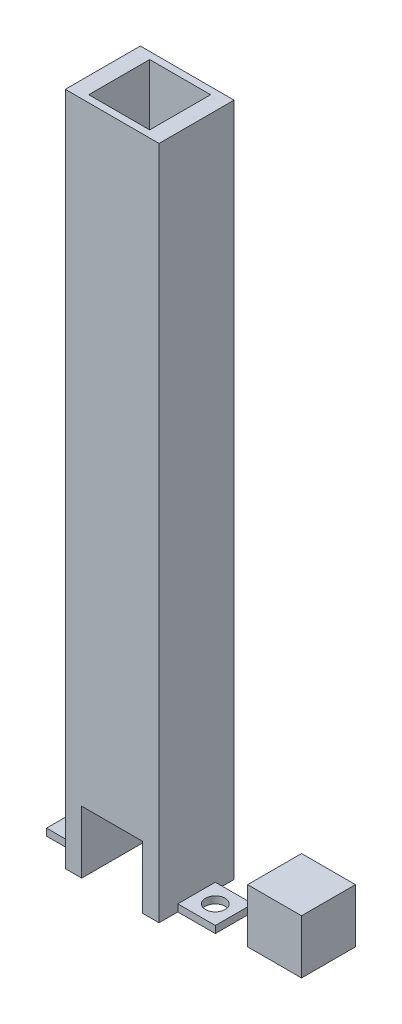
ISO-10303-21;
HEADER;
FILE_DESCRIPTION(('STEP AP214'),'2;1');
FILE_NAME('part.step','',(''),(''),'','','');
FILE_SCHEMA(('AUTOMOTIVE_DESIGN { 1 0 10303 214 1 1 1 1 }'));
ENDSEC;
DATA;
#1=APPLICATION_CONTEXT('core data for automotive mechanical design processes');
#2=APPLICATION_PROTOCOL_DEFINITION('international standard','automotive_design',2000,#1);
#3=PRODUCT_CONTEXT('',#1,'mechanical');
#4=PRODUCT('Part','Part','',(#3));
#5=PRODUCT_RELATED_PRODUCT_CATEGORY('part','',(#4));
#6=PRODUCT_DEFINITION_FORMATION('','',#4);
#7=PRODUCT_DEFINITION_CONTEXT('part definition',#1,'design');
#8=PRODUCT_DEFINITION('design','',#6,#7);
#9=PRODUCT_DEFINITION_SHAPE('','',#8);
#10=(LENGTH_UNIT() NAMED_UNIT(*) SI_UNIT(.MILLI.,.METRE.));
#11=(NAMED_UNIT(*) PLANE_ANGLE_UNIT() SI_UNIT($,.RADIAN.));
#12=(NAMED_UNIT(*) SI_UNIT($,.STERADIAN.) SOLID_ANGLE_UNIT());
#13=UNCERTAINTY_MEASURE_WITH_UNIT(LENGTH_MEASURE(1.E-05),#10,'distance_accuracy_value','');
#14=(GEOMETRIC_REPRESENTATION_CONTEXT(3) GLOBAL_UNCERTAINTY_ASSIGNED_CONTEXT((#13)) GLOBAL_UNIT_ASSIGNED_CONTEXT((#10,
#11,#12)) REPRESENTATION_CONTEXT('',''));
#15=CARTESIAN_POINT('',(0.,0.,0.));
#16=DIRECTION('',(0.,0.,1.));
#17=DIRECTION('',(1.,0.,0.));
#18=AXIS2_PLACEMENT_3D('',#15,#16,#17);
#19=CARTESIAN_POINT('',(-45.8981588772787,-12.,16.));
#20=DIRECTION('',(1.,0.,0.));
#21=DIRECTION('',(0.,0.,-1.));
#22=AXIS2_PLACEMENT_3D('',#19,#20,#21);
#23=PLANE('',#22);
#24=DIRECTION('',(0.,-1.,0.));
#25=VECTOR('',#24,1.);
#26=CARTESIAN_POINT('',(-45.8981588772787,-12.,4.));
#27=LINE('',#26,#25);
#28=CARTESIAN_POINT('',(-45.8981588772787,-10.5,4.));
#29=VERTEX_POINT('',#28);
#30=CARTESIAN_POINT('',(-45.8981588772787,-12.,4.));
#31=VERTEX_POINT('',#30);
#32=EDGE_CURVE('E66',#29,#31,#27,.T.);
#33=ORIENTED_EDGE('',*,*,#32,.F.);
#34=DIRECTION('',(0.,0.,-1.));
#35=VECTOR('',#34,1.);
#36=CARTESIAN_POINT('',(-45.8981588772787,-10.5,4.));
#37=LINE('',#36,#35);
#38=CARTESIAN_POINT('',(-45.8981588772787,-10.5,12.));
#39=VERTEX_POINT('',#38);
#40=EDGE_CURVE('E227',#39,#29,#37,.T.);
#41=ORIENTED_EDGE('',*,*,#40,.F.);
#42=DIRECTION('',(0.,1.,0.));
#43=VECTOR('',#42,1.);
#44=CARTESIAN_POINT('',(-45.8981588772787,-12.,12.));
#45=LINE('',#44,#43);
#46=CARTESIAN_POINT('',(-45.8981588772787,-12.,12.));
#47=VERTEX_POINT('',#46);
#48=EDGE_CURVE('E235',#47,#39,#45,.T.);
#49=ORIENTED_EDGE('',*,*,#48,.F.);
#50=DIRECTION('',(0.,0.,-1.));
#51=VECTOR('',#50,1.);
#52=CARTESIAN_POINT('',(-45.8981588772787,-12.,16.));
#53=LINE('',#52,#51);
#54=CARTESIAN_POINT('',(-45.8981588772787,-12.,16.));
#55=VERTEX_POINT('',#54);
#56=EDGE_CURVE('E12',#55,#47,#53,.T.);
#57=ORIENTED_EDGE('',*,*,#56,.F.);
#58=DIRECTION('',(0.,-1.,0.));
#59=VECTOR('',#58,1.);
#60=CARTESIAN_POINT('',(-45.8981588772787,-12.,16.));
#61=LINE('',#60,#59);
#62=CARTESIAN_POINT('',(-45.8981588772787,132.,16.));
#63=VERTEX_POINT('',#62);
#64=EDGE_CURVE('E307',#63,#55,#61,.T.);
#65=ORIENTED_EDGE('',*,*,#64,.F.);
#66=DIRECTION('',(0.,0.,-1.));
#67=VECTOR('',#66,1.);
#68=CARTESIAN_POINT('',(-45.8981588772787,132.,16.));
#69=LINE('',#68,#67);
#70=CARTESIAN_POINT('',(-45.8981588772787,132.,0.));
#71=VERTEX_POINT('',#70);
#72=EDGE_CURVE('E319',#63,#71,#69,.T.);
#73=ORIENTED_EDGE('',*,*,#72,.T.);
#74=DIRECTION('',(0.,-1.,0.));
#75=VECTOR('',#74,1.);
#76=CARTESIAN_POINT('',(-45.8981588772787,-12.,0.));
#77=LINE('',#76,#75);
#78=CARTESIAN_POINT('',(-45.8981588772787,-12.,0.));
#79=VERTEX_POINT('',#78);
#80=EDGE_CURVE('E301',#71,#79,#77,.T.);
#81=ORIENTED_EDGE('',*,*,#80,.T.);
#82=EDGE_CURVE('E51',#31,#79,#53,.T.);
#83=ORIENTED_EDGE('',*,*,#82,.F.);
#84=EDGE_LOOP('',(#33,#41,#49,#57,#65,#73,#81,#83));
#85=FACE_BOUND('',#84,.T.);
#86=ADVANCED_FACE('F44',(#85),#23,.F.);
#87=CARTESIAN_POINT('',(-45.8981588772787,-12.,16.));
#88=DIRECTION('',(0.,1.,0.));
#89=DIRECTION('',(0.,0.,1.));
#90=AXIS2_PLACEMENT_3D('',#87,#88,#89);
#91=PLANE('',#90);
#92=CARTESIAN_POINT('',(-49.8981588772787,-12.,8.));
#93=DIRECTION('',(0.,1.,0.));
#94=DIRECTION('',(0.,0.,1.));
#95=AXIS2_PLACEMENT_3D('',#92,#93,#94);
#96=CIRCLE('',#95,2.1);
#97=CARTESIAN_POINT('',(-49.8981588772787,-12.,10.1));
#98=VERTEX_POINT('',#97);
#99=EDGE_CURVE('E220',#98,#98,#96,.T.);
#100=ORIENTED_EDGE('',*,*,#99,.T.);
#101=EDGE_LOOP('',(#100));
#102=FACE_BOUND('',#101,.T.);
#103=DIRECTION('',(1.,0.,0.));
#104=VECTOR('',#103,1.);
#105=CARTESIAN_POINT('',(-45.8981588772787,-12.,0.));
#106=LINE('',#105,#104);
#107=CARTESIAN_POINT('',(-42.3981588772787,-12.,0.));
#108=VERTEX_POINT('',#107);
#109=EDGE_CURVE('E323',#79,#108,#106,.T.);
#110=ORIENTED_EDGE('',*,*,#109,.T.);
#111=DIRECTION('',(0.,0.,1.));
#112=VECTOR('',#111,1.);
#113=CARTESIAN_POINT('',(-42.3981588772787,-12.,1.5));
#114=LINE('',#113,#112);
#115=CARTESIAN_POINT('',(-42.3981588772787,-12.,16.));
#116=VERTEX_POINT('',#115);
#117=EDGE_CURVE('E285',#108,#116,#114,.T.);
#118=ORIENTED_EDGE('',*,*,#117,.T.);
#119=DIRECTION('',(1.,0.,0.));
#120=VECTOR('',#119,1.);
#121=CARTESIAN_POINT('',(-45.8981588772787,-12.,16.));
#122=LINE('',#121,#120);
#123=EDGE_CURVE('E312',#55,#116,#122,.T.);
#124=ORIENTED_EDGE('',*,*,#123,.F.);
#125=ORIENTED_EDGE('',*,*,#56,.T.);
#126=DIRECTION('',(1.,0.,0.));
#127=VECTOR('',#126,1.);
#128=CARTESIAN_POINT('',(-53.8981588772787,-12.,12.));
#129=LINE('',#128,#127);
#130=CARTESIAN_POINT('',(-53.8981588772787,-12.,12.));
#131=VERTEX_POINT('',#130);
#132=EDGE_CURVE('E244',#131,#47,#129,.T.);
#133=ORIENTED_EDGE('',*,*,#132,.F.);
#134=DIRECTION('',(0.,0.,1.));
#135=VECTOR('',#134,1.);
#136=CARTESIAN_POINT('',(-53.8981588772787,-12.,4.));
#137=LINE('',#136,#135);
#138=CARTESIAN_POINT('',(-53.8981588772787,-12.,4.));
#139=VERTEX_POINT('',#138);
#140=EDGE_CURVE('E226',#139,#131,#137,.T.);
#141=ORIENTED_EDGE('',*,*,#140,.F.);
#142=DIRECTION('',(1.,0.,0.));
#143=VECTOR('',#142,1.);
#144=CARTESIAN_POINT('',(-53.8981588772787,-12.,4.));
#145=LINE('',#144,#143);
#146=EDGE_CURVE('E247',#139,#31,#145,.T.);
#147=ORIENTED_EDGE('',*,*,#146,.T.);
#148=ORIENTED_EDGE('',*,*,#82,.T.);
#149=EDGE_LOOP('',(#110,#118,#124,#125,#133,#141,#147,#148));
#150=FACE_BOUND('',#149,.T.);
#151=ADVANCED_FACE('F379',(#102,#150),#91,.F.);
#152=CARTESIAN_POINT('',(-21.8981588772787,-12.,8.));
#153=DIRECTION('',(0.,1.,0.));
#154=DIRECTION('',(0.,0.,1.));
#155=AXIS2_PLACEMENT_3D('',#152,#153,#154);
#156=CIRCLE('',#155,2.1);
#157=CARTESIAN_POINT('',(-21.8981588772787,-12.,10.1));
#158=VERTEX_POINT('',#157);
#159=EDGE_CURVE('E210',#158,#158,#156,.F.);
#160=ORIENTED_EDGE('',*,*,#159,.F.);
#161=EDGE_LOOP('',(#160));
#162=FACE_BOUND('',#161,.T.);
#163=DIRECTION('',(0.,0.,1.));
#164=VECTOR('',#163,1.);
#165=CARTESIAN_POINT('',(-29.3981588772787,-12.,1.5));
#166=LINE('',#165,#164);
#167=CARTESIAN_POINT('',(-29.3981588772787,-12.,0.));
#168=VERTEX_POINT('',#167);
#169=CARTESIAN_POINT('',(-29.3981588772787,-12.,16.));
#170=VERTEX_POINT('',#169);
#171=EDGE_CURVE('E283',#168,#170,#166,.T.);
#172=ORIENTED_EDGE('',*,*,#171,.F.);
#173=CARTESIAN_POINT('',(-25.8981588772787,-12.,0.));
#174=VERTEX_POINT('',#173);
#175=EDGE_CURVE('E322',#168,#174,#106,.T.);
#176=ORIENTED_EDGE('',*,*,#175,.T.);
#177=DIRECTION('',(0.,0.,-1.));
#178=VECTOR('',#177,1.);
#179=CARTESIAN_POINT('',(-25.8981588772787,-12.,16.));
#180=LINE('',#179,#178);
#181=CARTESIAN_POINT('',(-25.8981588772787,-12.,4.));
#182=VERTEX_POINT('',#181);
#183=EDGE_CURVE('E333',#182,#174,#180,.T.);
#184=ORIENTED_EDGE('',*,*,#183,.F.);
#185=DIRECTION('',(-1.,0.,0.));
#186=VECTOR('',#185,1.);
#187=CARTESIAN_POINT('',(-17.8981588772787,-12.,4.));
#188=LINE('',#187,#186);
#189=CARTESIAN_POINT('',(-17.8981588772787,-12.,4.));
#190=VERTEX_POINT('',#189);
#191=EDGE_CURVE('E207',#190,#182,#188,.T.);
#192=ORIENTED_EDGE('',*,*,#191,.F.);
#193=DIRECTION('',(0.,0.,1.));
#194=VECTOR('',#193,1.);
#195=CARTESIAN_POINT('',(-17.8981588772787,-12.,4.));
#196=LINE('',#195,#194);
#197=CARTESIAN_POINT('',(-17.8981588772787,-12.,12.));
#198=VERTEX_POINT('',#197);
#199=EDGE_CURVE('E197',#190,#198,#196,.T.);
#200=ORIENTED_EDGE('',*,*,#199,.T.);
#201=DIRECTION('',(-1.,0.,0.));
#202=VECTOR('',#201,1.);
#203=CARTESIAN_POINT('',(-17.8981588772787,-12.,12.));
#204=LINE('',#203,#202);
#205=CARTESIAN_POINT('',(-25.8981588772787,-12.,12.));
#206=VERTEX_POINT('',#205);
#207=EDGE_CURVE('E215',#198,#206,#204,.T.);
#208=ORIENTED_EDGE('',*,*,#207,.T.);
#209=CARTESIAN_POINT('',(-25.8981588772787,-12.,16.));
#210=VERTEX_POINT('',#209);
#211=EDGE_CURVE('E334',#210,#206,#180,.T.);
#212=ORIENTED_EDGE('',*,*,#211,.F.);
#213=EDGE_CURVE('E310',#170,#210,#122,.T.);
#214=ORIENTED_EDGE('',*,*,#213,.F.);
#215=EDGE_LOOP('',(#172,#176,#184,#192,#200,#208,#212,#214));
#216=FACE_BOUND('',#215,.T.);
#217=ADVANCED_FACE('F346',(#162,#216),#91,.F.);
#218=CARTESIAN_POINT('',(-25.8981588772787,-12.,16.));
#219=DIRECTION('',(-1.,0.,0.));
#220=DIRECTION('',(0.,0.,1.));
#221=AXIS2_PLACEMENT_3D('',#218,#219,#220);
#222=PLANE('',#221);
#223=DIRECTION('',(0.,0.,-1.));
#224=VECTOR('',#223,1.);
#225=CARTESIAN_POINT('',(-25.8981588772787,-10.5,4.));
#226=LINE('',#225,#224);
#227=CARTESIAN_POINT('',(-25.8981588772787,-10.5,12.));
#228=VERTEX_POINT('',#227);
#229=CARTESIAN_POINT('',(-25.8981588772787,-10.5,4.));
#230=VERTEX_POINT('',#229);
#231=EDGE_CURVE('E209',#228,#230,#226,.T.);
#232=ORIENTED_EDGE('',*,*,#231,.T.);
#233=DIRECTION('',(0.,-1.,0.));
#234=VECTOR('',#233,1.);
#235=CARTESIAN_POINT('',(-25.8981588772787,-12.,4.));
#236=LINE('',#235,#234);
#237=EDGE_CURVE('E58',#230,#182,#236,.T.);
#238=ORIENTED_EDGE('',*,*,#237,.T.);
#239=ORIENTED_EDGE('',*,*,#183,.T.);
#240=DIRECTION('',(0.,1.,0.));
#241=VECTOR('',#240,1.);
#242=CARTESIAN_POINT('',(-25.8981588772787,-12.,0.));
#243=LINE('',#242,#241);
#244=CARTESIAN_POINT('',(-25.8981588772787,132.,0.));
#245=VERTEX_POINT('',#244);
#246=EDGE_CURVE('E326',#174,#245,#243,.T.);
#247=ORIENTED_EDGE('',*,*,#246,.T.);
#248=DIRECTION('',(0.,0.,-1.));
#249=VECTOR('',#248,1.);
#250=CARTESIAN_POINT('',(-25.8981588772787,132.,16.));
#251=LINE('',#250,#249);
#252=CARTESIAN_POINT('',(-25.8981588772787,132.,16.));
#253=VERTEX_POINT('',#252);
#254=EDGE_CURVE('E331',#253,#245,#251,.T.);
#255=ORIENTED_EDGE('',*,*,#254,.F.);
#256=DIRECTION('',(0.,1.,0.));
#257=VECTOR('',#256,1.);
#258=CARTESIAN_POINT('',(-25.8981588772787,-12.,16.));
#259=LINE('',#258,#257);
#260=EDGE_CURVE('E315',#210,#253,#259,.T.);
#261=ORIENTED_EDGE('',*,*,#260,.F.);
#262=ORIENTED_EDGE('',*,*,#211,.T.);
#263=DIRECTION('',(0.,1.,0.));
#264=VECTOR('',#263,1.);
#265=CARTESIAN_POINT('',(-25.8981588772787,-12.,12.));
#266=LINE('',#265,#264);
#267=EDGE_CURVE('E198',#206,#228,#266,.T.);
#268=ORIENTED_EDGE('',*,*,#267,.T.);
#269=EDGE_LOOP('',(#232,#238,#239,#247,#255,#261,#262,#268));
#270=FACE_BOUND('',#269,.T.);
#271=ADVANCED_FACE('F341',(#270),#222,.F.);
#272=CARTESIAN_POINT('',(-45.8981588772787,132.,16.));
#273=DIRECTION('',(0.,-1.,0.));
#274=DIRECTION('',(0.,0.,-1.));
#275=AXIS2_PLACEMENT_3D('',#272,#273,#274);
#276=PLANE('',#275);
#277=DIRECTION('',(0.,0.,1.));
#278=VECTOR('',#277,1.);
#279=CARTESIAN_POINT('',(-29.3981588772787,132.,1.5));
#280=LINE('',#279,#278);
#281=CARTESIAN_POINT('',(-29.3981588772787,132.,1.5));
#282=VERTEX_POINT('',#281);
#283=CARTESIAN_POINT('',(-29.3981588772787,132.,14.5));
#284=VERTEX_POINT('',#283);
#285=EDGE_CURVE('E291',#282,#284,#280,.T.);
#286=ORIENTED_EDGE('',*,*,#285,.T.);
#287=DIRECTION('',(1.,0.,0.));
#288=VECTOR('',#287,1.);
#289=CARTESIAN_POINT('',(-42.3981588772787,132.,14.5));
#290=LINE('',#289,#288);
#291=CARTESIAN_POINT('',(-42.3981588772787,132.,14.5));
#292=VERTEX_POINT('',#291);
#293=EDGE_CURVE('E282',#292,#284,#290,.T.);
#294=ORIENTED_EDGE('',*,*,#293,.F.);
#295=DIRECTION('',(0.,0.,1.));
#296=VECTOR('',#295,1.);
#297=CARTESIAN_POINT('',(-42.3981588772787,132.,1.5));
#298=LINE('',#297,#296);
#299=CARTESIAN_POINT('',(-42.3981588772787,132.,1.5));
#300=VERTEX_POINT('',#299);
#301=EDGE_CURVE('E286',#300,#292,#298,.T.);
#302=ORIENTED_EDGE('',*,*,#301,.F.);
#303=DIRECTION('',(1.,0.,0.));
#304=VECTOR('',#303,1.);
#305=CARTESIAN_POINT('',(-42.3981588772787,132.,1.5));
#306=LINE('',#305,#304);
#307=EDGE_CURVE('E294',#300,#282,#306,.T.);
#308=ORIENTED_EDGE('',*,*,#307,.T.);
#309=EDGE_LOOP('',(#286,#294,#302,#308));
#310=FACE_BOUND('',#309,.T.);
#311=DIRECTION('',(-1.,0.,0.));
#312=VECTOR('',#311,1.);
#313=CARTESIAN_POINT('',(-45.8981588772787,132.,0.));
#314=LINE('',#313,#312);
#315=EDGE_CURVE('E311',#245,#71,#314,.T.);
#316=ORIENTED_EDGE('',*,*,#315,.T.);
#317=ORIENTED_EDGE('',*,*,#72,.F.);
#318=DIRECTION('',(-1.,0.,0.));
#319=VECTOR('',#318,1.);
#320=CARTESIAN_POINT('',(-45.8981588772787,132.,16.));
#321=LINE('',#320,#319);
#322=EDGE_CURVE('E317',#253,#63,#321,.T.);
#323=ORIENTED_EDGE('',*,*,#322,.F.);
#324=ORIENTED_EDGE('',*,*,#254,.T.);
#325=EDGE_LOOP('',(#316,#317,#323,#324));
#326=FACE_BOUND('',#325,.T.);
#327=ADVANCED_FACE('F356',(#310,#326),#276,.F.);
#328=CARTESIAN_POINT('',(0.,0.,16.));
#329=DIRECTION('',(0.,0.,-1.));
#330=DIRECTION('',(-1.,0.,0.));
#331=AXIS2_PLACEMENT_3D('',#328,#329,#330);
#332=PLANE('',#331);
#333=ORIENTED_EDGE('',*,*,#123,.T.);
#334=DIRECTION('',(0.,-1.,0.));
#335=VECTOR('',#334,1.);
#336=CARTESIAN_POINT('',(-42.3981588772787,1.3,16.));
#337=LINE('',#336,#335);
#338=CARTESIAN_POINT('',(-42.3981588772787,1.3,16.));
#339=VERTEX_POINT('',#338);
#340=EDGE_CURVE('E266',#339,#116,#337,.T.);
#341=ORIENTED_EDGE('',*,*,#340,.F.);
#342=DIRECTION('',(-1.,0.,0.));
#343=VECTOR('',#342,1.);
#344=CARTESIAN_POINT('',(-29.3981588772787,1.3,16.));
#345=LINE('',#344,#343);
#346=CARTESIAN_POINT('',(-29.3981588772787,1.3,16.));
#347=VERTEX_POINT('',#346);
#348=EDGE_CURVE('E274',#347,#339,#345,.T.);
#349=ORIENTED_EDGE('',*,*,#348,.F.);
#350=DIRECTION('',(0.,-1.,0.));
#351=VECTOR('',#350,1.);
#352=CARTESIAN_POINT('',(-29.3981588772787,1.3,16.));
#353=LINE('',#352,#351);
#354=EDGE_CURVE('E271',#347,#170,#353,.T.);
#355=ORIENTED_EDGE('',*,*,#354,.T.);
#356=ORIENTED_EDGE('',*,*,#213,.T.);
#357=ORIENTED_EDGE('',*,*,#260,.T.);
#358=ORIENTED_EDGE('',*,*,#322,.T.);
#359=ORIENTED_EDGE('',*,*,#64,.T.);
#360=EDGE_LOOP('',(#333,#341,#349,#355,#356,#357,#358,#359));
#361=FACE_BOUND('',#360,.T.);
#362=ADVANCED_FACE('F361',(#361),#332,.F.);
#363=CARTESIAN_POINT('',(0.,0.,0.));
#364=DIRECTION('',(0.,0.,-1.));
#365=DIRECTION('',(-1.,0.,0.));
#366=AXIS2_PLACEMENT_3D('',#363,#364,#365);
#367=PLANE('',#366);
#368=DIRECTION('',(0.,-1.,0.));
#369=VECTOR('',#368,1.);
#370=CARTESIAN_POINT('',(-29.3981588772787,-4.,0.));
#371=LINE('',#370,#369);
#372=CARTESIAN_POINT('',(-29.3981588772787,-4.,0.));
#373=VERTEX_POINT('',#372);
#374=EDGE_CURVE('E250',#373,#168,#371,.T.);
#375=ORIENTED_EDGE('',*,*,#374,.F.);
#376=DIRECTION('',(1.,0.,0.));
#377=VECTOR('',#376,1.);
#378=CARTESIAN_POINT('',(-42.3981588772787,-4.,0.));
#379=LINE('',#378,#377);
#380=CARTESIAN_POINT('',(-42.3981588772787,-4.,0.));
#381=VERTEX_POINT('',#380);
#382=EDGE_CURVE('E258',#381,#373,#379,.T.);
#383=ORIENTED_EDGE('',*,*,#382,.F.);
#384=DIRECTION('',(0.,-1.,0.));
#385=VECTOR('',#384,1.);
#386=CARTESIAN_POINT('',(-42.3981588772787,-4.,0.));
#387=LINE('',#386,#385);
#388=EDGE_CURVE('E255',#381,#108,#387,.T.);
#389=ORIENTED_EDGE('',*,*,#388,.T.);
#390=ORIENTED_EDGE('',*,*,#109,.F.);
#391=ORIENTED_EDGE('',*,*,#80,.F.);
#392=ORIENTED_EDGE('',*,*,#315,.F.);
#393=ORIENTED_EDGE('',*,*,#246,.F.);
#394=ORIENTED_EDGE('',*,*,#175,.F.);
#395=EDGE_LOOP('',(#375,#383,#389,#390,#391,#392,#393,#394));
#396=FACE_BOUND('',#395,.T.);
#397=ADVANCED_FACE('F351',(#396),#367,.T.);
#398=CARTESIAN_POINT('',(-42.3981588772787,-12.,14.5));
#399=DIRECTION('',(0.,0.,1.));
#400=DIRECTION('',(1.,0.,0.));
#401=AXIS2_PLACEMENT_3D('',#398,#399,#400);
#402=PLANE('',#401);
#403=DIRECTION('',(0.,1.,0.));
#404=VECTOR('',#403,1.);
#405=CARTESIAN_POINT('',(-29.3981588772787,-12.,14.5));
#406=LINE('',#405,#404);
#407=CARTESIAN_POINT('',(-29.3981588772787,1.3,14.5));
#408=VERTEX_POINT('',#407);
#409=EDGE_CURVE('E288',#408,#284,#406,.T.);
#410=ORIENTED_EDGE('',*,*,#409,.F.);
#411=DIRECTION('',(-1.,0.,0.));
#412=VECTOR('',#411,1.);
#413=CARTESIAN_POINT('',(-29.3981588772787,1.3,14.5));
#414=LINE('',#413,#412);
#415=CARTESIAN_POINT('',(-42.3981588772787,1.3,14.5));
#416=VERTEX_POINT('',#415);
#417=EDGE_CURVE('E267',#408,#416,#414,.T.);
#418=ORIENTED_EDGE('',*,*,#417,.T.);
#419=DIRECTION('',(0.,1.,0.));
#420=VECTOR('',#419,1.);
#421=CARTESIAN_POINT('',(-42.3981588772787,-12.,14.5));
#422=LINE('',#421,#420);
#423=EDGE_CURVE('E299',#416,#292,#422,.T.);
#424=ORIENTED_EDGE('',*,*,#423,.T.);
#425=ORIENTED_EDGE('',*,*,#293,.T.);
#426=EDGE_LOOP('',(#410,#418,#424,#425));
#427=FACE_BOUND('',#426,.T.);
#428=ADVANCED_FACE('F397',(#427),#402,.F.);
#429=CARTESIAN_POINT('',(-42.3981588772787,-12.,1.5));
#430=DIRECTION('',(-1.,0.,0.));
#431=DIRECTION('',(0.,0.,1.));
#432=AXIS2_PLACEMENT_3D('',#429,#430,#431);
#433=PLANE('',#432);
#434=ORIENTED_EDGE('',*,*,#301,.T.);
#435=ORIENTED_EDGE('',*,*,#423,.F.);
#436=DIRECTION('',(0.,0.,1.));
#437=VECTOR('',#436,1.);
#438=CARTESIAN_POINT('',(-42.3981588772787,1.3,14.5));
#439=LINE('',#438,#437);
#440=EDGE_CURVE('E280',#416,#339,#439,.T.);
#441=ORIENTED_EDGE('',*,*,#440,.T.);
#442=ORIENTED_EDGE('',*,*,#340,.T.);
#443=ORIENTED_EDGE('',*,*,#117,.F.);
#444=ORIENTED_EDGE('',*,*,#388,.F.);
#445=DIRECTION('',(0.,0.,-1.));
#446=VECTOR('',#445,1.);
#447=CARTESIAN_POINT('',(-42.3981588772787,-4.,1.5));
#448=LINE('',#447,#446);
#449=CARTESIAN_POINT('',(-42.3981588772787,-4.,1.5));
#450=VERTEX_POINT('',#449);
#451=EDGE_CURVE('E254',#450,#381,#448,.T.);
#452=ORIENTED_EDGE('',*,*,#451,.F.);
#453=DIRECTION('',(0.,1.,0.));
#454=VECTOR('',#453,1.);
#455=CARTESIAN_POINT('',(-42.3981588772787,-12.,1.5));
#456=LINE('',#455,#454);
#457=EDGE_CURVE('E302',#450,#300,#456,.T.);
#458=ORIENTED_EDGE('',*,*,#457,.T.);
#459=EDGE_LOOP('',(#434,#435,#441,#442,#443,#444,#452,#458));
#460=FACE_BOUND('',#459,.T.);
#461=ADVANCED_FACE('F402',(#460),#433,.F.);
#462=CARTESIAN_POINT('',(-42.3981588772787,-12.,1.5));
#463=DIRECTION('',(0.,0.,1.));
#464=DIRECTION('',(1.,0.,0.));
#465=AXIS2_PLACEMENT_3D('',#462,#463,#464);
#466=PLANE('',#465);
#467=DIRECTION('',(1.,0.,0.));
#468=VECTOR('',#467,1.);
#469=CARTESIAN_POINT('',(-42.3981588772787,-4.,1.5));
#470=LINE('',#469,#468);
#471=CARTESIAN_POINT('',(-29.3981588772787,-4.,1.5));
#472=VERTEX_POINT('',#471);
#473=EDGE_CURVE('E251',#450,#472,#470,.T.);
#474=ORIENTED_EDGE('',*,*,#473,.T.);
#475=DIRECTION('',(0.,1.,0.));
#476=VECTOR('',#475,1.);
#477=CARTESIAN_POINT('',(-29.3981588772787,-12.,1.5));
#478=LINE('',#477,#476);
#479=EDGE_CURVE('E304',#472,#282,#478,.T.);
#480=ORIENTED_EDGE('',*,*,#479,.T.);
#481=ORIENTED_EDGE('',*,*,#307,.F.);
#482=ORIENTED_EDGE('',*,*,#457,.F.);
#483=EDGE_LOOP('',(#474,#480,#481,#482));
#484=FACE_BOUND('',#483,.T.);
#485=ADVANCED_FACE('F408',(#484),#466,.T.);
#486=CARTESIAN_POINT('',(-29.3981588772787,-12.,1.5));
#487=DIRECTION('',(-1.,0.,0.));
#488=DIRECTION('',(0.,0.,1.));
#489=AXIS2_PLACEMENT_3D('',#486,#487,#488);
#490=PLANE('',#489);
#491=ORIENTED_EDGE('',*,*,#285,.F.);
#492=ORIENTED_EDGE('',*,*,#479,.F.);
#493=DIRECTION('',(0.,0.,-1.));
#494=VECTOR('',#493,1.);
#495=CARTESIAN_POINT('',(-29.3981588772787,-4.,1.5));
#496=LINE('',#495,#494);
#497=EDGE_CURVE('E264',#472,#373,#496,.T.);
#498=ORIENTED_EDGE('',*,*,#497,.T.);
#499=ORIENTED_EDGE('',*,*,#374,.T.);
#500=ORIENTED_EDGE('',*,*,#171,.T.);
#501=ORIENTED_EDGE('',*,*,#354,.F.);
#502=DIRECTION('',(0.,0.,1.));
#503=VECTOR('',#502,1.);
#504=CARTESIAN_POINT('',(-29.3981588772787,1.3,14.5));
#505=LINE('',#504,#503);
#506=EDGE_CURVE('E270',#408,#347,#505,.T.);
#507=ORIENTED_EDGE('',*,*,#506,.F.);
#508=ORIENTED_EDGE('',*,*,#409,.T.);
#509=EDGE_LOOP('',(#491,#492,#498,#499,#500,#501,#507,#508));
#510=FACE_BOUND('',#509,.T.);
#511=ADVANCED_FACE('F404',(#510),#490,.T.);
#512=CARTESIAN_POINT('',(-29.3981588772787,1.3,14.5));
#513=DIRECTION('',(0.,1.,0.));
#514=DIRECTION('',(-1.,0.,0.));
#515=AXIS2_PLACEMENT_3D('',#512,#513,#514);
#516=PLANE('',#515);
#517=ORIENTED_EDGE('',*,*,#348,.T.);
#518=ORIENTED_EDGE('',*,*,#440,.F.);
#519=ORIENTED_EDGE('',*,*,#417,.F.);
#520=ORIENTED_EDGE('',*,*,#506,.T.);
#521=EDGE_LOOP('',(#517,#518,#519,#520));
#522=FACE_BOUND('',#521,.T.);
#523=ADVANCED_FACE('F407',(#522),#516,.F.);
#524=CARTESIAN_POINT('',(-42.3981588772787,-4.,1.5));
#525=DIRECTION('',(0.,1.,0.));
#526=DIRECTION('',(-1.,0.,0.));
#527=AXIS2_PLACEMENT_3D('',#524,#525,#526);
#528=PLANE('',#527);
#529=ORIENTED_EDGE('',*,*,#382,.T.);
#530=ORIENTED_EDGE('',*,*,#497,.F.);
#531=ORIENTED_EDGE('',*,*,#473,.F.);
#532=ORIENTED_EDGE('',*,*,#451,.T.);
#533=EDGE_LOOP('',(#529,#530,#531,#532));
#534=FACE_BOUND('',#533,.T.);
#535=ADVANCED_FACE('F418',(#534),#528,.F.);
#536=CARTESIAN_POINT('',(-53.8981588772787,-12.,4.));
#537=DIRECTION('',(0.,0.,1.));
#538=DIRECTION('',(1.,0.,0.));
#539=AXIS2_PLACEMENT_3D('',#536,#537,#538);
#540=PLANE('',#539);
#541=ORIENTED_EDGE('',*,*,#32,.T.);
#542=ORIENTED_EDGE('',*,*,#146,.F.);
#543=DIRECTION('',(0.,-1.,0.));
#544=VECTOR('',#543,1.);
#545=CARTESIAN_POINT('',(-53.8981588772787,-12.,4.));
#546=LINE('',#545,#544);
#547=CARTESIAN_POINT('',(-53.8981588772787,-10.5,4.));
#548=VERTEX_POINT('',#547);
#549=EDGE_CURVE('E223',#548,#139,#546,.T.);
#550=ORIENTED_EDGE('',*,*,#549,.F.);
#551=DIRECTION('',(1.,0.,0.));
#552=VECTOR('',#551,1.);
#553=CARTESIAN_POINT('',(-53.8981588772787,-10.5,4.));
#554=LINE('',#553,#552);
#555=EDGE_CURVE('E233',#548,#29,#554,.T.);
#556=ORIENTED_EDGE('',*,*,#555,.T.);
#557=EDGE_LOOP('',(#541,#542,#550,#556));
#558=FACE_BOUND('',#557,.T.);
#559=ADVANCED_FACE('F422',(#558),#540,.F.);
#560=CARTESIAN_POINT('',(-53.8981588772787,-12.,12.));
#561=DIRECTION('',(0.,0.,-1.));
#562=DIRECTION('',(-1.,0.,0.));
#563=AXIS2_PLACEMENT_3D('',#560,#561,#562);
#564=PLANE('',#563);
#565=ORIENTED_EDGE('',*,*,#48,.T.);
#566=DIRECTION('',(1.,0.,0.));
#567=VECTOR('',#566,1.);
#568=CARTESIAN_POINT('',(-53.8981588772787,-10.5,12.));
#569=LINE('',#568,#567);
#570=CARTESIAN_POINT('',(-53.8981588772787,-10.5,12.));
#571=VERTEX_POINT('',#570);
#572=EDGE_CURVE('E241',#571,#39,#569,.T.);
#573=ORIENTED_EDGE('',*,*,#572,.F.);
#574=DIRECTION('',(0.,1.,0.));
#575=VECTOR('',#574,1.);
#576=CARTESIAN_POINT('',(-53.8981588772787,-12.,12.));
#577=LINE('',#576,#575);
#578=EDGE_CURVE('E229',#131,#571,#577,.T.);
#579=ORIENTED_EDGE('',*,*,#578,.F.);
#580=ORIENTED_EDGE('',*,*,#132,.T.);
#581=EDGE_LOOP('',(#565,#573,#579,#580));
#582=FACE_BOUND('',#581,.T.);
#583=ADVANCED_FACE('F426',(#582),#564,.F.);
#584=CARTESIAN_POINT('',(-53.8981588772787,-10.5,4.));
#585=DIRECTION('',(0.,-1.,0.));
#586=DIRECTION('',(0.,0.,-1.));
#587=AXIS2_PLACEMENT_3D('',#584,#585,#586);
#588=PLANE('',#587);
#589=CARTESIAN_POINT('',(-49.8981588772787,-10.5,8.));
#590=DIRECTION('',(0.,1.,0.));
#591=DIRECTION('',(0.,0.,1.));
#592=AXIS2_PLACEMENT_3D('',#589,#590,#591);
#593=CIRCLE('',#592,2.1);
#594=CARTESIAN_POINT('',(-49.8981588772787,-10.5,10.1));
#595=VERTEX_POINT('',#594);
#596=EDGE_CURVE('E187',#595,#595,#593,.T.);
#597=ORIENTED_EDGE('',*,*,#596,.F.);
#598=EDGE_LOOP('',(#597));
#599=FACE_BOUND('',#598,.T.);
#600=ORIENTED_EDGE('',*,*,#40,.T.);
#601=ORIENTED_EDGE('',*,*,#555,.F.);
#602=DIRECTION('',(0.,0.,-1.));
#603=VECTOR('',#602,1.);
#604=CARTESIAN_POINT('',(-53.8981588772787,-10.5,4.));
#605=LINE('',#604,#603);
#606=EDGE_CURVE('E231',#571,#548,#605,.T.);
#607=ORIENTED_EDGE('',*,*,#606,.F.);
#608=ORIENTED_EDGE('',*,*,#572,.T.);
#609=EDGE_LOOP('',(#600,#601,#607,#608));
#610=FACE_BOUND('',#609,.T.);
#611=ADVANCED_FACE('F430',(#599,#610),#588,.F.);
#612=CARTESIAN_POINT('',(-53.8981588772787,0.,0.));
#613=DIRECTION('',(1.,0.,0.));
#614=DIRECTION('',(0.,0.,-1.));
#615=AXIS2_PLACEMENT_3D('',#612,#613,#614);
#616=PLANE('',#615);
#617=ORIENTED_EDGE('',*,*,#549,.T.);
#618=ORIENTED_EDGE('',*,*,#140,.T.);
#619=ORIENTED_EDGE('',*,*,#578,.T.);
#620=ORIENTED_EDGE('',*,*,#606,.T.);
#621=EDGE_LOOP('',(#617,#618,#619,#620));
#622=FACE_BOUND('',#621,.T.);
#623=ADVANCED_FACE('F434',(#622),#616,.F.);
#624=CARTESIAN_POINT('',(-49.8981588772787,-20.5,8.));
#625=DIRECTION('',(0.,1.,0.));
#626=DIRECTION('',(0.,0.,1.));
#627=AXIS2_PLACEMENT_3D('',#624,#625,#626);
#628=CYLINDRICAL_SURFACE('',#627,2.1);
#629=ORIENTED_EDGE('',*,*,#596,.T.);
#630=EDGE_LOOP('',(#629));
#631=FACE_BOUND('',#630,.T.);
#632=ORIENTED_EDGE('',*,*,#99,.F.);
#633=EDGE_LOOP('',(#632));
#634=FACE_BOUND('',#633,.T.);
#635=ADVANCED_FACE('F438',(#631,#634),#628,.F.);
#636=CARTESIAN_POINT('',(-17.8981588772787,-12.,4.));
#637=DIRECTION('',(0.,0.,-1.));
#638=DIRECTION('',(-1.,0.,0.));
#639=AXIS2_PLACEMENT_3D('',#636,#637,#638);
#640=PLANE('',#639);
#641=ORIENTED_EDGE('',*,*,#237,.F.);
#642=DIRECTION('',(-1.,0.,0.));
#643=VECTOR('',#642,1.);
#644=CARTESIAN_POINT('',(-17.8981588772787,-10.5,4.));
#645=LINE('',#644,#643);
#646=CARTESIAN_POINT('',(-17.8981588772787,-10.5,4.));
#647=VERTEX_POINT('',#646);
#648=EDGE_CURVE('E178',#647,#230,#645,.T.);
#649=ORIENTED_EDGE('',*,*,#648,.F.);
#650=DIRECTION('',(0.,-1.,0.));
#651=VECTOR('',#650,1.);
#652=CARTESIAN_POINT('',(-17.8981588772787,-12.,4.));
#653=LINE('',#652,#651);
#654=EDGE_CURVE('E181',#647,#190,#653,.T.);
#655=ORIENTED_EDGE('',*,*,#654,.T.);
#656=ORIENTED_EDGE('',*,*,#191,.T.);
#657=EDGE_LOOP('',(#641,#649,#655,#656));
#658=FACE_BOUND('',#657,.T.);
#659=ADVANCED_FACE('F180',(#658),#640,.T.);
#660=CARTESIAN_POINT('',(-17.8981588772787,-10.5,4.));
#661=DIRECTION('',(0.,1.,0.));
#662=DIRECTION('',(0.,0.,1.));
#663=AXIS2_PLACEMENT_3D('',#660,#661,#662);
#664=PLANE('',#663);
#665=CARTESIAN_POINT('',(-21.8981588772787,-10.5,8.));
#666=DIRECTION('',(0.,-1.,0.));
#667=DIRECTION('',(0.,0.,1.));
#668=AXIS2_PLACEMENT_3D('',#665,#666,#667);
#669=CIRCLE('',#668,2.1);
#670=CARTESIAN_POINT('',(-21.8981588772787,-10.5,10.1));
#671=VERTEX_POINT('',#670);
#672=EDGE_CURVE('E479',#671,#671,#669,.T.);
#673=ORIENTED_EDGE('',*,*,#672,.T.);
#674=EDGE_LOOP('',(#673));
#675=FACE_BOUND('',#674,.T.);
#676=ORIENTED_EDGE('',*,*,#231,.F.);
#677=DIRECTION('',(-1.,0.,0.));
#678=VECTOR('',#677,1.);
#679=CARTESIAN_POINT('',(-17.8981588772787,-10.5,12.));
#680=LINE('',#679,#678);
#681=CARTESIAN_POINT('',(-17.8981588772787,-10.5,12.));
#682=VERTEX_POINT('',#681);
#683=EDGE_CURVE('E188',#682,#228,#680,.T.);
#684=ORIENTED_EDGE('',*,*,#683,.F.);
#685=DIRECTION('',(0.,0.,-1.));
#686=VECTOR('',#685,1.);
#687=CARTESIAN_POINT('',(-17.8981588772787,-10.5,4.));
#688=LINE('',#687,#686);
#689=EDGE_CURVE('E194',#682,#647,#688,.T.);
#690=ORIENTED_EDGE('',*,*,#689,.T.);
#691=ORIENTED_EDGE('',*,*,#648,.T.);
#692=EDGE_LOOP('',(#676,#684,#690,#691));
#693=FACE_BOUND('',#692,.T.);
#694=ADVANCED_FACE('F200',(#675,#693),#664,.T.);
#695=CARTESIAN_POINT('',(-17.8981588772787,-12.,12.));
#696=DIRECTION('',(0.,0.,1.));
#697=DIRECTION('',(1.,0.,0.));
#698=AXIS2_PLACEMENT_3D('',#695,#696,#697);
#699=PLANE('',#698);
#700=ORIENTED_EDGE('',*,*,#267,.F.);
#701=ORIENTED_EDGE('',*,*,#207,.F.);
#702=DIRECTION('',(0.,1.,0.));
#703=VECTOR('',#702,1.);
#704=CARTESIAN_POINT('',(-17.8981588772787,-12.,12.));
#705=LINE('',#704,#703);
#706=EDGE_CURVE('E201',#198,#682,#705,.T.);
#707=ORIENTED_EDGE('',*,*,#706,.T.);
#708=ORIENTED_EDGE('',*,*,#683,.T.);
#709=EDGE_LOOP('',(#700,#701,#707,#708));
#710=FACE_BOUND('',#709,.T.);
#711=ADVANCED_FACE('F367',(#710),#699,.T.);
#712=CARTESIAN_POINT('',(-17.8981588772787,0.,0.));
#713=DIRECTION('',(-1.,0.,0.));
#714=DIRECTION('',(0.,0.,-1.));
#715=AXIS2_PLACEMENT_3D('',#712,#713,#714);
#716=PLANE('',#715);
#717=ORIENTED_EDGE('',*,*,#654,.F.);
#718=ORIENTED_EDGE('',*,*,#689,.F.);
#719=ORIENTED_EDGE('',*,*,#706,.F.);
#720=ORIENTED_EDGE('',*,*,#199,.F.);
#721=EDGE_LOOP('',(#717,#718,#719,#720));
#722=FACE_BOUND('',#721,.T.);
#723=ADVANCED_FACE('F192',(#722),#716,.F.);
#724=CARTESIAN_POINT('',(-21.8981588772787,-20.5,8.));
#725=DIRECTION('',(0.,1.,0.));
#726=DIRECTION('',(0.,0.,1.));
#727=AXIS2_PLACEMENT_3D('',#724,#725,#726);
#728=CYLINDRICAL_SURFACE('',#727,2.1);
#729=ORIENTED_EDGE('',*,*,#672,.F.);
#730=EDGE_LOOP('',(#729));
#731=FACE_BOUND('',#730,.T.);
#732=ORIENTED_EDGE('',*,*,#159,.T.);
#733=EDGE_LOOP('',(#732));
#734=FACE_BOUND('',#733,.T.);
#735=ADVANCED_FACE('F374',(#731,#734),#728,.F.);
#736=CLOSED_SHELL('',(#86,#151,#217,#271,#327,#362,#397,#428,#461,#485,#511,#523,#535,#559,#583,
#611,#623,#635,#659,#694,#711,#723,#735));
#737=MANIFOLD_SOLID_BREP('B2',#736);
#738=CARTESIAN_POINT('',(0.,0.,11.5));
#739=DIRECTION('',(-1.,0.,0.));
#740=DIRECTION('',(0.,-1.,0.));
#741=AXIS2_PLACEMENT_3D('',#738,#739,#740);
#742=PLANE('',#741);
#743=DIRECTION('',(0.,1.,0.));
#744=VECTOR('',#743,1.);
#745=CARTESIAN_POINT('',(0.,0.,0.));
#746=LINE('',#745,#744);
#747=CARTESIAN_POINT('',(0.,-11.5,0.));
#748=VERTEX_POINT('',#747);
#749=CARTESIAN_POINT('',(0.,0.,0.));
#750=VERTEX_POINT('',#749);
#751=EDGE_CURVE('E692',#748,#750,#746,.T.);
#752=ORIENTED_EDGE('',*,*,#751,.T.);
#753=DIRECTION('',(0.,0.,-1.));
#754=VECTOR('',#753,1.);
#755=CARTESIAN_POINT('',(0.,0.,11.5));
#756=LINE('',#755,#754);
#757=CARTESIAN_POINT('',(0.,0.,11.5));
#758=VERTEX_POINT('',#757);
#759=EDGE_CURVE('E42',#758,#750,#756,.T.);
#760=ORIENTED_EDGE('',*,*,#759,.F.);
#761=DIRECTION('',(0.,1.,0.));
#762=VECTOR('',#761,1.);
#763=CARTESIAN_POINT('',(0.,0.,11.5));
#764=LINE('',#763,#762);
#765=CARTESIAN_POINT('',(0.,-11.5,11.5));
#766=VERTEX_POINT('',#765);
#767=EDGE_CURVE('E680',#766,#758,#764,.T.);
#768=ORIENTED_EDGE('',*,*,#767,.F.);
#769=DIRECTION('',(0.,0.,-1.));
#770=VECTOR('',#769,1.);
#771=CARTESIAN_POINT('',(0.,-11.5,11.5));
#772=LINE('',#771,#770);
#773=EDGE_CURVE('E688',#766,#748,#772,.T.);
#774=ORIENTED_EDGE('',*,*,#773,.T.);
#775=EDGE_LOOP('',(#752,#760,#768,#774));
#776=FACE_BOUND('',#775,.T.);
#777=ADVANCED_FACE('F629',(#776),#742,.F.);
#778=CARTESIAN_POINT('',(0.,0.,11.5));
#779=DIRECTION('',(0.,-1.,0.));
#780=DIRECTION('',(1.,0.,0.));
#781=AXIS2_PLACEMENT_3D('',#778,#779,#780);
#782=PLANE('',#781);
#783=DIRECTION('',(-1.,0.,0.));
#784=VECTOR('',#783,1.);
#785=CARTESIAN_POINT('',(0.,0.,0.));
#786=LINE('',#785,#784);
#787=CARTESIAN_POINT('',(-11.5,0.,0.));
#788=VERTEX_POINT('',#787);
#789=EDGE_CURVE('E684',#750,#788,#786,.T.);
#790=ORIENTED_EDGE('',*,*,#789,.T.);
#791=DIRECTION('',(0.,0.,-1.));
#792=VECTOR('',#791,1.);
#793=CARTESIAN_POINT('',(-11.5,0.,11.5));
#794=LINE('',#793,#792);
#795=CARTESIAN_POINT('',(-11.5,0.,11.5));
#796=VERTEX_POINT('',#795);
#797=EDGE_CURVE('E637',#796,#788,#794,.T.);
#798=ORIENTED_EDGE('',*,*,#797,.F.);
#799=DIRECTION('',(-1.,0.,0.));
#800=VECTOR('',#799,1.);
#801=CARTESIAN_POINT('',(0.,0.,11.5));
#802=LINE('',#801,#800);
#803=EDGE_CURVE('E675',#758,#796,#802,.T.);
#804=ORIENTED_EDGE('',*,*,#803,.F.);
#805=ORIENTED_EDGE('',*,*,#759,.T.);
#806=EDGE_LOOP('',(#790,#798,#804,#805));
#807=FACE_BOUND('',#806,.T.);
#808=ADVANCED_FACE('F683',(#807),#782,.F.);
#809=CARTESIAN_POINT('',(-11.5,0.,11.5));
#810=DIRECTION('',(1.,0.,0.));
#811=DIRECTION('',(0.,1.,0.));
#812=AXIS2_PLACEMENT_3D('',#809,#810,#811);
#813=PLANE('',#812);
#814=DIRECTION('',(0.,-1.,0.));
#815=VECTOR('',#814,1.);
#816=CARTESIAN_POINT('',(-11.5,0.,0.));
#817=LINE('',#816,#815);
#818=CARTESIAN_POINT('',(-11.5,-11.5,0.));
#819=VERTEX_POINT('',#818);
#820=EDGE_CURVE('E662',#788,#819,#817,.T.);
#821=ORIENTED_EDGE('',*,*,#820,.T.);
#822=DIRECTION('',(0.,0.,-1.));
#823=VECTOR('',#822,1.);
#824=CARTESIAN_POINT('',(-11.5,-11.5,11.5));
#825=LINE('',#824,#823);
#826=CARTESIAN_POINT('',(-11.5,-11.5,11.5));
#827=VERTEX_POINT('',#826);
#828=EDGE_CURVE('E685',#827,#819,#825,.T.);
#829=ORIENTED_EDGE('',*,*,#828,.F.);
#830=DIRECTION('',(0.,-1.,0.));
#831=VECTOR('',#830,1.);
#832=CARTESIAN_POINT('',(-11.5,0.,11.5));
#833=LINE('',#832,#831);
#834=EDGE_CURVE('E678',#796,#827,#833,.T.);
#835=ORIENTED_EDGE('',*,*,#834,.F.);
#836=ORIENTED_EDGE('',*,*,#797,.T.);
#837=EDGE_LOOP('',(#821,#829,#835,#836));
#838=FACE_BOUND('',#837,.T.);
#839=ADVANCED_FACE('F686',(#838),#813,.F.);
#840=CARTESIAN_POINT('',(0.,-11.5,11.5));
#841=DIRECTION('',(0.,1.,0.));
#842=DIRECTION('',(-1.,0.,0.));
#843=AXIS2_PLACEMENT_3D('',#840,#841,#842);
#844=PLANE('',#843);
#845=DIRECTION('',(1.,0.,0.));
#846=VECTOR('',#845,1.);
#847=CARTESIAN_POINT('',(0.,-11.5,0.));
#848=LINE('',#847,#846);
#849=EDGE_CURVE('E668',#819,#748,#848,.T.);
#850=ORIENTED_EDGE('',*,*,#849,.T.);
#851=ORIENTED_EDGE('',*,*,#773,.F.);
#852=DIRECTION('',(1.,0.,0.));
#853=VECTOR('',#852,1.);
#854=CARTESIAN_POINT('',(0.,-11.5,11.5));
#855=LINE('',#854,#853);
#856=EDGE_CURVE('E645',#827,#766,#855,.T.);
#857=ORIENTED_EDGE('',*,*,#856,.F.);
#858=ORIENTED_EDGE('',*,*,#828,.T.);
#859=EDGE_LOOP('',(#850,#851,#857,#858));
#860=FACE_BOUND('',#859,.T.);
#861=ADVANCED_FACE('F699',(#860),#844,.F.);
#862=CARTESIAN_POINT('',(0.,0.,11.5));
#863=DIRECTION('',(0.,0.,-1.));
#864=DIRECTION('',(-1.,0.,0.));
#865=AXIS2_PLACEMENT_3D('',#862,#863,#864);
#866=PLANE('',#865);
#867=ORIENTED_EDGE('',*,*,#767,.T.);
#868=ORIENTED_EDGE('',*,*,#803,.T.);
#869=ORIENTED_EDGE('',*,*,#834,.T.);
#870=ORIENTED_EDGE('',*,*,#856,.T.);
#871=EDGE_LOOP('',(#867,#868,#869,#870));
#872=FACE_BOUND('',#871,.T.);
#873=ADVANCED_FACE('F676',(#872),#866,.F.);
#874=CARTESIAN_POINT('',(0.,0.,0.));
#875=DIRECTION('',(0.,0.,-1.));
#876=DIRECTION('',(-1.,0.,0.));
#877=AXIS2_PLACEMENT_3D('',#874,#875,#876);
#878=PLANE('',#877);
#879=ORIENTED_EDGE('',*,*,#751,.F.);
#880=ORIENTED_EDGE('',*,*,#849,.F.);
#881=ORIENTED_EDGE('',*,*,#820,.F.);
#882=ORIENTED_EDGE('',*,*,#789,.F.);
#883=EDGE_LOOP('',(#879,#880,#881,#882));
#884=FACE_BOUND('',#883,.T.);
#885=ADVANCED_FACE('F702',(#884),#878,.T.);
#886=CLOSED_SHELL('',(#777,#808,#839,#861,#873,#885));
#887=MANIFOLD_SOLID_BREP('B6_NOT_SHOWN',#886);
#888=ADVANCED_BREP_SHAPE_REPRESENTATION('',(#18,#737,#887),#14);
#889=SHAPE_DEFINITION_REPRESENTATION(#9,#888);
ENDSEC;
END-ISO-10303-21;
